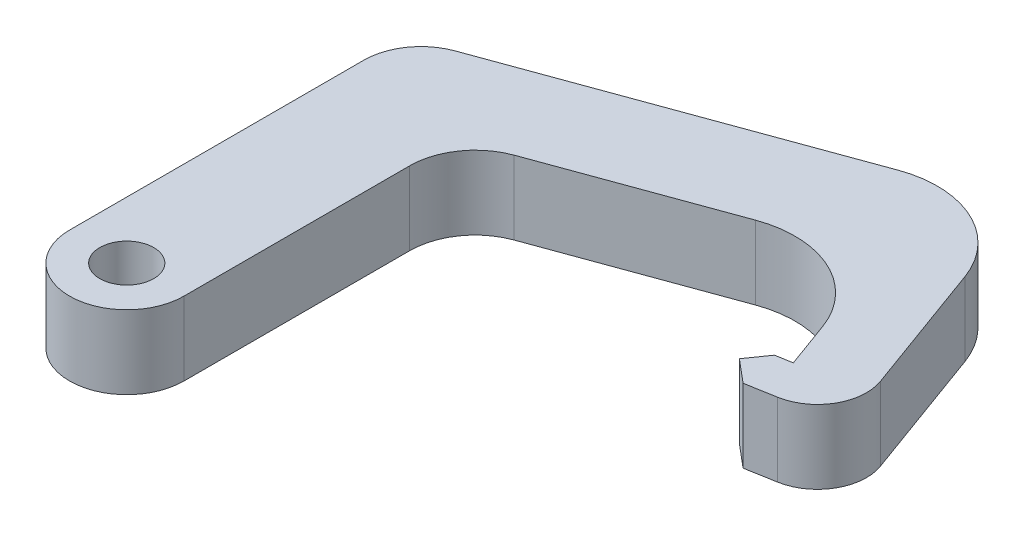
ISO-10303-21;
HEADER;
FILE_DESCRIPTION(('STEP AP214'),'2;1');
FILE_NAME('part.step','',(''),(''),'','','');
FILE_SCHEMA(('AUTOMOTIVE_DESIGN { 1 0 10303 214 1 1 1 1 }'));
ENDSEC;
DATA;
#1=APPLICATION_CONTEXT('core data for automotive mechanical design processes');
#2=APPLICATION_PROTOCOL_DEFINITION('international standard','automotive_design',2000,#1);
#3=PRODUCT_CONTEXT('',#1,'mechanical');
#4=PRODUCT('Part','Part','',(#3));
#5=PRODUCT_RELATED_PRODUCT_CATEGORY('part','',(#4));
#6=PRODUCT_DEFINITION_FORMATION('','',#4);
#7=PRODUCT_DEFINITION_CONTEXT('part definition',#1,'design');
#8=PRODUCT_DEFINITION('design','',#6,#7);
#9=PRODUCT_DEFINITION_SHAPE('','',#8);
#10=(LENGTH_UNIT() NAMED_UNIT(*) SI_UNIT(.MILLI.,.METRE.));
#11=(NAMED_UNIT(*) PLANE_ANGLE_UNIT() SI_UNIT($,.RADIAN.));
#12=(NAMED_UNIT(*) SI_UNIT($,.STERADIAN.) SOLID_ANGLE_UNIT());
#13=UNCERTAINTY_MEASURE_WITH_UNIT(LENGTH_MEASURE(1.E-05),#10,'distance_accuracy_value','');
#14=(GEOMETRIC_REPRESENTATION_CONTEXT(3) GLOBAL_UNCERTAINTY_ASSIGNED_CONTEXT((#13)) GLOBAL_UNIT_ASSIGNED_CONTEXT((#10,
#11,#12)) REPRESENTATION_CONTEXT('',''));
#15=CARTESIAN_POINT('',(0.,0.,0.));
#16=DIRECTION('',(0.,0.,1.));
#17=DIRECTION('',(1.,0.,0.));
#18=AXIS2_PLACEMENT_3D('',#15,#16,#17);
#19=CARTESIAN_POINT('',(3.5,4.5,0.));
#20=DIRECTION('',(-1.,0.,0.));
#21=DIRECTION('',(0.,0.,1.));
#22=AXIS2_PLACEMENT_3D('',#19,#20,#21);
#23=PLANE('',#22);
#24=DIRECTION('',(0.,0.,-1.));
#25=VECTOR('',#24,1.);
#26=CARTESIAN_POINT('',(3.5,0.,0.));
#27=LINE('',#26,#25);
#28=CARTESIAN_POINT('',(3.5,0.,0.));
#29=VERTEX_POINT('',#28);
#30=CARTESIAN_POINT('',(3.5,0.,-13.8126212359031));
#31=VERTEX_POINT('',#30);
#32=EDGE_CURVE('E204',#29,#31,#27,.T.);
#33=ORIENTED_EDGE('',*,*,#32,.T.);
#34=DIRECTION('',(0.,-1.,0.));
#35=VECTOR('',#34,1.);
#36=CARTESIAN_POINT('',(3.5,4.5,-13.8126212359031));
#37=LINE('',#36,#35);
#38=CARTESIAN_POINT('',(3.5,4.5,-13.8126212359031));
#39=VERTEX_POINT('',#38);
#40=EDGE_CURVE('E243',#31,#39,#37,.F.);
#41=ORIENTED_EDGE('',*,*,#40,.T.);
#42=DIRECTION('',(0.,0.,-1.));
#43=VECTOR('',#42,1.);
#44=CARTESIAN_POINT('',(3.5,4.5,0.));
#45=LINE('',#44,#43);
#46=CARTESIAN_POINT('',(3.5,4.5,0.));
#47=VERTEX_POINT('',#46);
#48=EDGE_CURVE('E339',#47,#39,#45,.T.);
#49=ORIENTED_EDGE('',*,*,#48,.F.);
#50=DIRECTION('',(0.,-1.,0.));
#51=VECTOR('',#50,1.);
#52=CARTESIAN_POINT('',(3.5,4.5,0.));
#53=LINE('',#52,#51);
#54=EDGE_CURVE('E200',#47,#29,#53,.T.);
#55=ORIENTED_EDGE('',*,*,#54,.T.);
#56=EDGE_LOOP('',(#33,#41,#49,#55));
#57=FACE_BOUND('',#56,.T.);
#58=ADVANCED_FACE('F44',(#57),#23,.F.);
#59=CARTESIAN_POINT('',(-4.93003812886465,4.5,-13.5451684361061));
#60=DIRECTION('',(0.342020143325666,0.,0.939692620785909));
#61=DIRECTION('',(0.93969262078591,0.,-0.342020143325666));
#62=AXIS2_PLACEMENT_3D('',#59,#60,#61);
#63=PLANE('',#62);
#64=DIRECTION('',(-0.939692620785909,0.,0.342020143325666));
#65=VECTOR('',#64,1.);
#66=CARTESIAN_POINT('',(-4.93003812886465,0.,-13.5451684361061));
#67=LINE('',#66,#65);
#68=CARTESIAN_POINT('',(16.959118700357,0.,-21.5121699751274));
#69=VERTEX_POINT('',#68);
#70=CARTESIAN_POINT('',(6.13191942669734,0.,-17.5713917190467));
#71=VERTEX_POINT('',#70);
#72=EDGE_CURVE('E207',#69,#71,#67,.T.);
#73=ORIENTED_EDGE('',*,*,#72,.F.);
#74=DIRECTION('',(0.,-1.,0.));
#75=VECTOR('',#74,1.);
#76=CARTESIAN_POINT('',(16.959118700357,4.5,-21.5121699751274));
#77=LINE('',#76,#75);
#78=CARTESIAN_POINT('',(16.959118700357,4.5,-21.5121699751274));
#79=VERTEX_POINT('',#78);
#80=EDGE_CURVE('E261',#69,#79,#77,.F.);
#81=ORIENTED_EDGE('',*,*,#80,.T.);
#82=DIRECTION('',(-0.939692620785909,0.,0.342020143325666));
#83=VECTOR('',#82,1.);
#84=CARTESIAN_POINT('',(-4.93003812886465,4.5,-13.5451684361061));
#85=LINE('',#84,#83);
#86=CARTESIAN_POINT('',(6.13191942669734,4.5,-17.5713917190467));
#87=VERTEX_POINT('',#86);
#88=EDGE_CURVE('E168',#79,#87,#85,.T.);
#89=ORIENTED_EDGE('',*,*,#88,.T.);
#90=DIRECTION('',(0.,-1.,0.));
#91=VECTOR('',#90,1.);
#92=CARTESIAN_POINT('',(6.13191942669734,4.5,-17.5713917190467));
#93=LINE('',#92,#91);
#94=EDGE_CURVE('E175',#87,#71,#93,.T.);
#95=ORIENTED_EDGE('',*,*,#94,.T.);
#96=EDGE_LOOP('',(#73,#81,#89,#95));
#97=FACE_BOUND('',#96,.T.);
#98=ADVANCED_FACE('F300',(#97),#63,.T.);
#99=CARTESIAN_POINT('',(27.5273125539371,4.5,-10.0191223989754));
#100=DIRECTION('',(0.939692620785909,0.,-0.342020143325666));
#101=DIRECTION('',(-0.342020143325666,0.,-0.939692620785909));
#102=AXIS2_PLACEMENT_3D('',#99,#100,#101);
#103=PLANE('',#102);
#104=DIRECTION('',(0.342020143325666,0.,0.939692620785909));
#105=VECTOR('',#104,1.);
#106=CARTESIAN_POINT('',(27.5273125539371,4.5,-10.0191223989754));
#107=LINE('',#106,#105);
#108=CARTESIAN_POINT('',(24.6493952850264,4.5,-17.926135110366));
#109=VERTEX_POINT('',#108);
#110=CARTESIAN_POINT('',(25.6754557150034,4.5,-15.1070572480082));
#111=VERTEX_POINT('',#110);
#112=EDGE_CURVE('E157',#109,#111,#107,.T.);
#113=ORIENTED_EDGE('',*,*,#112,.F.);
#114=DIRECTION('',(0.,-1.,0.));
#115=VECTOR('',#114,1.);
#116=CARTESIAN_POINT('',(24.6493952850264,4.5,-17.926135110366));
#117=LINE('',#116,#115);
#118=CARTESIAN_POINT('',(24.6493952850264,0.,-17.926135110366));
#119=VERTEX_POINT('',#118);
#120=EDGE_CURVE('E259',#109,#119,#117,.T.);
#121=ORIENTED_EDGE('',*,*,#120,.T.);
#122=DIRECTION('',(0.342020143325666,0.,0.939692620785909));
#123=VECTOR('',#122,1.);
#124=CARTESIAN_POINT('',(27.5273125539371,0.,-10.0191223989754));
#125=LINE('',#124,#123);
#126=CARTESIAN_POINT('',(25.6754557150034,0.,-15.1070572480082));
#127=VERTEX_POINT('',#126);
#128=EDGE_CURVE('E174',#119,#127,#125,.T.);
#129=ORIENTED_EDGE('',*,*,#128,.T.);
#130=DIRECTION('',(0.,-1.,0.));
#131=VECTOR('',#130,1.);
#132=CARTESIAN_POINT('',(25.6754557150034,4.5,-15.1070572480082));
#133=LINE('',#132,#131);
#134=EDGE_CURVE('E171',#111,#127,#133,.T.);
#135=ORIENTED_EDGE('',*,*,#134,.F.);
#136=EDGE_LOOP('',(#113,#121,#129,#135));
#137=FACE_BOUND('',#136,.T.);
#138=ADVANCED_FACE('F172',(#137),#103,.F.);
#139=CARTESIAN_POINT('',(-1.80924922044675,4.5,-10.2607622110774));
#140=DIRECTION('',(0.173648177666927,0.,0.984807753012209));
#141=DIRECTION('',(0.984807753012209,0.,-0.173648177666927));
#142=AXIS2_PLACEMENT_3D('',#139,#140,#141);
#143=PLANE('',#142);
#144=DIRECTION('',(-0.984807753012209,0.,0.173648177666927));
#145=VECTOR('',#144,1.);
#146=CARTESIAN_POINT('',(-1.80924922044675,0.,-10.2607622110774));
#147=LINE('',#146,#145);
#148=CARTESIAN_POINT('',(24.6906479619912,0.,-14.9334090703413));
#149=VERTEX_POINT('',#148);
#150=EDGE_CURVE('E210',#127,#149,#147,.T.);
#151=ORIENTED_EDGE('',*,*,#150,.T.);
#152=DIRECTION('',(0.,1.,0.));
#153=VECTOR('',#152,1.);
#154=CARTESIAN_POINT('',(24.6906479619912,4.5,-14.9334090703413));
#155=LINE('',#154,#153);
#156=CARTESIAN_POINT('',(24.6906479619912,4.5,-14.9334090703413));
#157=VERTEX_POINT('',#156);
#158=EDGE_CURVE('E53',#149,#157,#155,.T.);
#159=ORIENTED_EDGE('',*,*,#158,.T.);
#160=DIRECTION('',(-0.984807753012209,0.,0.173648177666927));
#161=VECTOR('',#160,1.);
#162=CARTESIAN_POINT('',(-1.80924922044675,4.5,-10.2607622110774));
#163=LINE('',#162,#161);
#164=EDGE_CURVE('E160',#111,#157,#163,.T.);
#165=ORIENTED_EDGE('',*,*,#164,.F.);
#166=ORIENTED_EDGE('',*,*,#134,.T.);
#167=EDGE_LOOP('',(#151,#159,#165,#166));
#168=FACE_BOUND('',#167,.T.);
#169=ADVANCED_FACE('F178',(#168),#143,.F.);
#170=CARTESIAN_POINT('',(16.5700417316632,4.5,-19.7474067631455));
#171=DIRECTION('',(-0.64278760968654,0.,0.766044443118978));
#172=DIRECTION('',(0.766044443118978,0.,0.64278760968654));
#173=AXIS2_PLACEMENT_3D('',#170,#171,#172);
#174=PLANE('',#173);
#175=DIRECTION('',(-0.766044443118978,0.,-0.64278760968654));
#176=VECTOR('',#175,1.);
#177=CARTESIAN_POINT('',(16.5700417316632,4.5,-19.7474067631455));
#178=LINE('',#177,#176);
#179=CARTESIAN_POINT('',(25.2210324559668,4.5,-12.4883636370643));
#180=VERTEX_POINT('',#179);
#181=CARTESIAN_POINT('',(23.8085211194927,4.5,-13.6736013785334));
#182=VERTEX_POINT('',#181);
#183=EDGE_CURVE('E179',#180,#182,#178,.T.);
#184=ORIENTED_EDGE('',*,*,#183,.T.);
#185=DIRECTION('',(0.,-1.,0.));
#186=VECTOR('',#185,1.);
#187=CARTESIAN_POINT('',(23.8085211194927,0.,-13.6736013785334));
#188=LINE('',#187,#186);
#189=CARTESIAN_POINT('',(23.8085211194927,0.,-13.6736013785334));
#190=VERTEX_POINT('',#189);
#191=EDGE_CURVE('E275',#182,#190,#188,.T.);
#192=ORIENTED_EDGE('',*,*,#191,.T.);
#193=DIRECTION('',(-0.766044443118978,0.,-0.64278760968654));
#194=VECTOR('',#193,1.);
#195=CARTESIAN_POINT('',(16.5700417316632,0.,-19.7474067631455));
#196=LINE('',#195,#194);
#197=CARTESIAN_POINT('',(25.2210324559668,0.,-12.4883636370643));
#198=VERTEX_POINT('',#197);
#199=EDGE_CURVE('E212',#198,#190,#196,.T.);
#200=ORIENTED_EDGE('',*,*,#199,.F.);
#201=DIRECTION('',(0.,-1.,0.));
#202=VECTOR('',#201,1.);
#203=CARTESIAN_POINT('',(25.2210324559668,4.5,-12.4883636370643));
#204=LINE('',#203,#202);
#205=EDGE_CURVE('E176',#180,#198,#204,.T.);
#206=ORIENTED_EDGE('',*,*,#205,.F.);
#207=EDGE_LOOP('',(#184,#192,#200,#206));
#208=FACE_BOUND('',#207,.T.);
#209=ADVANCED_FACE('F281',(#208),#174,.T.);
#210=CARTESIAN_POINT('',(-1.37512877627942,4.5,-7.79874282854692));
#211=DIRECTION('',(0.173648177666924,0.,0.984807753012209));
#212=DIRECTION('',(0.984807753012209,0.,-0.173648177666924));
#213=AXIS2_PLACEMENT_3D('',#210,#211,#212);
#214=PLANE('',#213);
#215=DIRECTION('',(-0.984807753012209,0.,0.173648177666924));
#216=VECTOR('',#215,1.);
#217=CARTESIAN_POINT('',(-1.37512877627942,0.,-7.79874282854692));
#218=LINE('',#217,#216);
#219=CARTESIAN_POINT('',(27.0227520703373,0.,-12.8060554167494));
#220=VERTEX_POINT('',#219);
#221=EDGE_CURVE('E214',#220,#198,#218,.T.);
#222=ORIENTED_EDGE('',*,*,#221,.F.);
#223=DIRECTION('',(0.,-1.,0.));
#224=VECTOR('',#223,1.);
#225=CARTESIAN_POINT('',(27.0227520703373,4.5,-12.8060554167494));
#226=LINE('',#225,#224);
#227=CARTESIAN_POINT('',(27.0227520703373,4.5,-12.8060554167494));
#228=VERTEX_POINT('',#227);
#229=EDGE_CURVE('E271',#220,#228,#226,.F.);
#230=ORIENTED_EDGE('',*,*,#229,.T.);
#231=DIRECTION('',(-0.984807753012209,0.,0.173648177666924));
#232=VECTOR('',#231,1.);
#233=CARTESIAN_POINT('',(-1.37512877627942,4.5,-7.79874282854692));
#234=LINE('',#233,#232);
#235=EDGE_CURVE('E182',#228,#180,#234,.T.);
#236=ORIENTED_EDGE('',*,*,#235,.T.);
#237=ORIENTED_EDGE('',*,*,#205,.T.);
#238=EDGE_LOOP('',(#222,#230,#236,#237));
#239=FACE_BOUND('',#238,.T.);
#240=ADVANCED_FACE('F289',(#239),#214,.T.);
#241=CARTESIAN_POINT('',(31.2860830370807,4.5,-11.387202972278));
#242=DIRECTION('',(0.939692620785909,0.,-0.342020143325666));
#243=DIRECTION('',(-0.342020143325666,0.,-0.93969262078591));
#244=AXIS2_PLACEMENT_3D('',#241,#242,#243);
#245=PLANE('',#244);
#246=DIRECTION('',(0.342020143325666,0.,0.939692620785909));
#247=VECTOR('',#246,1.);
#248=CARTESIAN_POINT('',(31.2860830370807,4.5,-11.387202972278));
#249=LINE('',#248,#247);
#250=CARTESIAN_POINT('',(26.3560449082161,4.5,-24.9323714083841));
#251=VERTEX_POINT('',#250);
#252=CARTESIAN_POINT('',(29.3208853996942,4.5,-16.786539105763));
#253=VERTEX_POINT('',#252);
#254=EDGE_CURVE('E187',#251,#253,#249,.T.);
#255=ORIENTED_EDGE('',*,*,#254,.T.);
#256=DIRECTION('',(0.,-1.,0.));
#257=VECTOR('',#256,1.);
#258=CARTESIAN_POINT('',(29.3208853996942,4.5,-16.786539105763));
#259=LINE('',#258,#257);
#260=CARTESIAN_POINT('',(29.3208853996942,0.,-16.786539105763));
#261=VERTEX_POINT('',#260);
#262=EDGE_CURVE('E266',#253,#261,#259,.T.);
#263=ORIENTED_EDGE('',*,*,#262,.T.);
#264=DIRECTION('',(0.342020143325666,0.,0.939692620785909));
#265=VECTOR('',#264,1.);
#266=CARTESIAN_POINT('',(31.2860830370807,0.,-11.387202972278));
#267=LINE('',#266,#265);
#268=CARTESIAN_POINT('',(26.3560449082161,0.,-24.9323714083841));
#269=VERTEX_POINT('',#268);
#270=EDGE_CURVE('E216',#269,#261,#267,.T.);
#271=ORIENTED_EDGE('',*,*,#270,.F.);
#272=DIRECTION('',(0.,-1.,0.));
#273=VECTOR('',#272,1.);
#274=CARTESIAN_POINT('',(26.3560449082161,4.5,-24.9323714083841));
#275=LINE('',#274,#273);
#276=EDGE_CURVE('E255',#269,#251,#275,.F.);
#277=ORIENTED_EDGE('',*,*,#276,.T.);
#278=EDGE_LOOP('',(#255,#263,#271,#277));
#279=FACE_BOUND('',#278,.T.);
#280=ADVANCED_FACE('F359',(#279),#245,.T.);
#281=CARTESIAN_POINT('',(-6.98215898881865,4.5,-19.1833241608215));
#282=DIRECTION('',(-0.342020143325666,0.,-0.939692620785909));
#283=DIRECTION('',(-0.93969262078591,0.,0.342020143325666));
#284=AXIS2_PLACEMENT_3D('',#281,#282,#283);
#285=PLANE('',#284);
#286=DIRECTION('',(0.939692620785909,0.,-0.342020143325666));
#287=VECTOR('',#286,1.);
#288=CARTESIAN_POINT('',(-6.98215898881865,4.5,-19.1833241608215));
#289=LINE('',#288,#287);
#290=CARTESIAN_POINT('',(-1.19707050163983,4.5,-21.2889241727507));
#291=VERTEX_POINT('',#290);
#292=CARTESIAN_POINT('',(18.6657683235466,4.5,-28.5184062731456));
#293=VERTEX_POINT('',#292);
#294=EDGE_CURVE('E190',#291,#293,#289,.T.);
#295=ORIENTED_EDGE('',*,*,#294,.T.);
#296=DIRECTION('',(0.,-1.,0.));
#297=VECTOR('',#296,1.);
#298=CARTESIAN_POINT('',(18.6657683235466,4.5,-28.5184062731456));
#299=LINE('',#298,#297);
#300=CARTESIAN_POINT('',(18.6657683235466,0.,-28.5184062731456));
#301=VERTEX_POINT('',#300);
#302=EDGE_CURVE('E250',#293,#301,#299,.T.);
#303=ORIENTED_EDGE('',*,*,#302,.T.);
#304=DIRECTION('',(0.939692620785909,0.,-0.342020143325666));
#305=VECTOR('',#304,1.);
#306=CARTESIAN_POINT('',(-6.98215898881865,0.,-19.1833241608215));
#307=LINE('',#306,#305);
#308=CARTESIAN_POINT('',(-1.19707050163983,0.,-21.2889241727507));
#309=VERTEX_POINT('',#308);
#310=EDGE_CURVE('E219',#309,#301,#307,.T.);
#311=ORIENTED_EDGE('',*,*,#310,.F.);
#312=DIRECTION('',(0.,-1.,0.));
#313=VECTOR('',#312,1.);
#314=CARTESIAN_POINT('',(-1.19707050163983,4.5,-21.2889241727507));
#315=LINE('',#314,#313);
#316=EDGE_CURVE('E237',#291,#309,#315,.T.);
#317=ORIENTED_EDGE('',*,*,#316,.F.);
#318=EDGE_LOOP('',(#295,#303,#311,#317));
#319=FACE_BOUND('',#318,.T.);
#320=ADVANCED_FACE('F352',(#319),#285,.T.);
#321=CARTESIAN_POINT('',(0.,4.5,-18.));
#322=DIRECTION('',(0.,-1.,0.));
#323=DIRECTION('',(0.,0.,-1.));
#324=AXIS2_PLACEMENT_3D('',#321,#322,#323);
#325=CYLINDRICAL_SURFACE('',#324,3.5);
#326=CARTESIAN_POINT('',(0.,0.,-18.));
#327=DIRECTION('',(0.,1.,0.));
#328=DIRECTION('',(0.,0.,1.));
#329=AXIS2_PLACEMENT_3D('',#326,#327,#328);
#330=CIRCLE('',#329,3.5);
#331=CARTESIAN_POINT('',(-3.5,0.,-18.));
#332=VERTEX_POINT('',#331);
#333=EDGE_CURVE('E222',#309,#332,#330,.T.);
#334=ORIENTED_EDGE('',*,*,#333,.T.);
#335=DIRECTION('',(0.,-1.,0.));
#336=VECTOR('',#335,1.);
#337=CARTESIAN_POINT('',(-3.5,4.5,-18.));
#338=LINE('',#337,#336);
#339=CARTESIAN_POINT('',(-3.5,4.5,-18.));
#340=VERTEX_POINT('',#339);
#341=EDGE_CURVE('E235',#340,#332,#338,.T.);
#342=ORIENTED_EDGE('',*,*,#341,.F.);
#343=CARTESIAN_POINT('',(0.,4.5,-18.));
#344=DIRECTION('',(0.,1.,0.));
#345=DIRECTION('',(0.,0.,1.));
#346=AXIS2_PLACEMENT_3D('',#343,#344,#345);
#347=CIRCLE('',#346,3.5);
#348=EDGE_CURVE('E193',#291,#340,#347,.T.);
#349=ORIENTED_EDGE('',*,*,#348,.F.);
#350=ORIENTED_EDGE('',*,*,#316,.T.);
#351=EDGE_LOOP('',(#334,#342,#349,#350));
#352=FACE_BOUND('',#351,.T.);
#353=ADVANCED_FACE('F349',(#352),#325,.T.);
#354=CARTESIAN_POINT('',(-3.5,4.5,0.));
#355=DIRECTION('',(-1.,0.,0.));
#356=DIRECTION('',(0.,0.,1.));
#357=AXIS2_PLACEMENT_3D('',#354,#355,#356);
#358=PLANE('',#357);
#359=DIRECTION('',(0.,0.,-1.));
#360=VECTOR('',#359,1.);
#361=CARTESIAN_POINT('',(-3.5,0.,0.));
#362=LINE('',#361,#360);
#363=CARTESIAN_POINT('',(-3.5,0.,0.));
#364=VERTEX_POINT('',#363);
#365=EDGE_CURVE('E225',#364,#332,#362,.T.);
#366=ORIENTED_EDGE('',*,*,#365,.F.);
#367=DIRECTION('',(0.,-1.,0.));
#368=VECTOR('',#367,1.);
#369=CARTESIAN_POINT('',(-3.5,4.5,0.));
#370=LINE('',#369,#368);
#371=CARTESIAN_POINT('',(-3.5,4.5,0.));
#372=VERTEX_POINT('',#371);
#373=EDGE_CURVE('E233',#372,#364,#370,.T.);
#374=ORIENTED_EDGE('',*,*,#373,.F.);
#375=DIRECTION('',(0.,0.,-1.));
#376=VECTOR('',#375,1.);
#377=CARTESIAN_POINT('',(-3.5,4.5,0.));
#378=LINE('',#377,#376);
#379=EDGE_CURVE('E195',#372,#340,#378,.T.);
#380=ORIENTED_EDGE('',*,*,#379,.T.);
#381=ORIENTED_EDGE('',*,*,#341,.T.);
#382=EDGE_LOOP('',(#366,#374,#380,#381));
#383=FACE_BOUND('',#382,.T.);
#384=ADVANCED_FACE('F314',(#383),#358,.T.);
#385=CARTESIAN_POINT('',(0.,4.5,0.));
#386=DIRECTION('',(0.,-1.,0.));
#387=DIRECTION('',(0.,0.,-1.));
#388=AXIS2_PLACEMENT_3D('',#385,#386,#387);
#389=CYLINDRICAL_SURFACE('',#388,1.65);
#390=CARTESIAN_POINT('',(0.,4.5,0.));
#391=DIRECTION('',(0.,1.,0.));
#392=DIRECTION('',(0.,0.,1.));
#393=AXIS2_PLACEMENT_3D('',#390,#391,#392);
#394=CIRCLE('',#393,1.65);
#395=CARTESIAN_POINT('',(0.,4.5,1.65));
#396=VERTEX_POINT('',#395);
#397=EDGE_CURVE('E230',#396,#396,#394,.T.);
#398=ORIENTED_EDGE('',*,*,#397,.T.);
#399=EDGE_LOOP('',(#398));
#400=FACE_BOUND('',#399,.T.);
#401=CARTESIAN_POINT('',(0.,0.,0.));
#402=DIRECTION('',(0.,1.,0.));
#403=DIRECTION('',(0.,0.,1.));
#404=AXIS2_PLACEMENT_3D('',#401,#402,#403);
#405=CIRCLE('',#404,1.65);
#406=CARTESIAN_POINT('',(0.,0.,1.65));
#407=VERTEX_POINT('',#406);
#408=EDGE_CURVE('E201',#407,#407,#405,.T.);
#409=ORIENTED_EDGE('',*,*,#408,.F.);
#410=EDGE_LOOP('',(#409));
#411=FACE_BOUND('',#410,.T.);
#412=ADVANCED_FACE('F310',(#400,#411),#389,.F.);
#413=CARTESIAN_POINT('',(0.,4.5,0.));
#414=DIRECTION('',(0.,-1.,0.));
#415=DIRECTION('',(0.,0.,-1.));
#416=AXIS2_PLACEMENT_3D('',#413,#414,#415);
#417=CYLINDRICAL_SURFACE('',#416,3.5);
#418=CARTESIAN_POINT('',(0.,0.,0.));
#419=DIRECTION('',(0.,1.,0.));
#420=DIRECTION('',(0.,0.,1.));
#421=AXIS2_PLACEMENT_3D('',#418,#419,#420);
#422=CIRCLE('',#421,3.5);
#423=EDGE_CURVE('E228',#364,#29,#422,.T.);
#424=ORIENTED_EDGE('',*,*,#423,.T.);
#425=ORIENTED_EDGE('',*,*,#54,.F.);
#426=CARTESIAN_POINT('',(0.,4.5,0.));
#427=DIRECTION('',(0.,1.,0.));
#428=DIRECTION('',(0.,0.,1.));
#429=AXIS2_PLACEMENT_3D('',#426,#427,#428);
#430=CIRCLE('',#429,3.5);
#431=EDGE_CURVE('E198',#372,#47,#430,.T.);
#432=ORIENTED_EDGE('',*,*,#431,.F.);
#433=ORIENTED_EDGE('',*,*,#373,.T.);
#434=EDGE_LOOP('',(#424,#425,#432,#433));
#435=FACE_BOUND('',#434,.T.);
#436=ADVANCED_FACE('F313',(#435),#417,.T.);
#437=CARTESIAN_POINT('',(0.,4.5,0.));
#438=DIRECTION('',(0.,1.,0.));
#439=DIRECTION('',(0.,0.,1.));
#440=AXIS2_PLACEMENT_3D('',#437,#438,#439);
#441=PLANE('',#440);
#442=ORIENTED_EDGE('',*,*,#397,.F.);
#443=EDGE_LOOP('',(#442));
#444=FACE_BOUND('',#443,.T.);
#445=ORIENTED_EDGE('',*,*,#164,.T.);
#446=DIRECTION('',(-0.573576436351052,0.,0.819152044288988));
#447=VECTOR('',#446,1.);
#448=CARTESIAN_POINT('',(9.55126630508881,4.5,6.68786866627168));
#449=LINE('',#448,#447);
#450=EDGE_CURVE('E11',#157,#182,#449,.T.);
#451=ORIENTED_EDGE('',*,*,#450,.T.);
#452=ORIENTED_EDGE('',*,*,#183,.F.);
#453=ORIENTED_EDGE('',*,*,#235,.F.);
#454=CARTESIAN_POINT('',(26.5018075373365,4.5,-15.760478675786));
#455=DIRECTION('',(0.,1.,0.));
#456=DIRECTION('',(0.,0.,1.));
#457=AXIS2_PLACEMENT_3D('',#454,#455,#456);
#458=CIRCLE('',#457,3.);
#459=EDGE_CURVE('E273',#228,#253,#458,.T.);
#460=ORIENTED_EDGE('',*,*,#459,.T.);
#461=ORIENTED_EDGE('',*,*,#254,.F.);
#462=CARTESIAN_POINT('',(20.7178891835006,4.5,-22.8802505484301));
#463=DIRECTION('',(0.,1.,0.));
#464=DIRECTION('',(0.,0.,1.));
#465=AXIS2_PLACEMENT_3D('',#462,#463,#464);
#466=CIRCLE('',#465,6.);
#467=EDGE_CURVE('E257',#251,#293,#466,.T.);
#468=ORIENTED_EDGE('',*,*,#467,.T.);
#469=ORIENTED_EDGE('',*,*,#294,.F.);
#470=ORIENTED_EDGE('',*,*,#348,.T.);
#471=ORIENTED_EDGE('',*,*,#379,.F.);
#472=ORIENTED_EDGE('',*,*,#431,.T.);
#473=ORIENTED_EDGE('',*,*,#48,.T.);
#474=CARTESIAN_POINT('',(7.5,4.5,-13.8126212359031));
#475=DIRECTION('',(0.,1.,0.));
#476=DIRECTION('',(0.,0.,1.));
#477=AXIS2_PLACEMENT_3D('',#474,#475,#476);
#478=CIRCLE('',#477,4.);
#479=EDGE_CURVE('E247',#39,#87,#478,.F.);
#480=ORIENTED_EDGE('',*,*,#479,.T.);
#481=ORIENTED_EDGE('',*,*,#88,.F.);
#482=CARTESIAN_POINT('',(19.011239560311,4.5,-15.874014250412));
#483=DIRECTION('',(0.,1.,0.));
#484=DIRECTION('',(0.,0.,1.));
#485=AXIS2_PLACEMENT_3D('',#482,#483,#484);
#486=CIRCLE('',#485,6.);
#487=EDGE_CURVE('E164',#79,#109,#486,.F.);
#488=ORIENTED_EDGE('',*,*,#487,.T.);
#489=ORIENTED_EDGE('',*,*,#112,.T.);
#490=EDGE_LOOP('',(#445,#451,#452,#453,#460,#461,#468,#469,#470,#471,#472,#473,#480,#481,#488,#489));
#491=FACE_BOUND('',#490,.T.);
#492=ADVANCED_FACE('F159',(#444,#491),#441,.T.);
#493=CARTESIAN_POINT('',(0.,0.,0.));
#494=DIRECTION('',(0.,1.,0.));
#495=DIRECTION('',(0.,0.,1.));
#496=AXIS2_PLACEMENT_3D('',#493,#494,#495);
#497=PLANE('',#496);
#498=ORIENTED_EDGE('',*,*,#408,.T.);
#499=EDGE_LOOP('',(#498));
#500=FACE_BOUND('',#499,.T.);
#501=ORIENTED_EDGE('',*,*,#199,.T.);
#502=DIRECTION('',(0.573576436351052,0.,-0.819152044288988));
#503=VECTOR('',#502,1.);
#504=CARTESIAN_POINT('',(23.8085211194927,0.,-13.6736013785334));
#505=LINE('',#504,#503);
#506=EDGE_CURVE('E67',#190,#149,#505,.T.);
#507=ORIENTED_EDGE('',*,*,#506,.T.);
#508=ORIENTED_EDGE('',*,*,#150,.F.);
#509=ORIENTED_EDGE('',*,*,#128,.F.);
#510=CARTESIAN_POINT('',(19.011239560311,0.,-15.874014250412));
#511=DIRECTION('',(0.,1.,0.));
#512=DIRECTION('',(0.,0.,1.));
#513=AXIS2_PLACEMENT_3D('',#510,#511,#512);
#514=CIRCLE('',#513,6.);
#515=EDGE_CURVE('E263',#119,#69,#514,.T.);
#516=ORIENTED_EDGE('',*,*,#515,.T.);
#517=ORIENTED_EDGE('',*,*,#72,.T.);
#518=CARTESIAN_POINT('',(7.5,0.,-13.8126212359031));
#519=DIRECTION('',(0.,1.,0.));
#520=DIRECTION('',(0.,0.,1.));
#521=AXIS2_PLACEMENT_3D('',#518,#519,#520);
#522=CIRCLE('',#521,4.);
#523=EDGE_CURVE('E245',#71,#31,#522,.T.);
#524=ORIENTED_EDGE('',*,*,#523,.T.);
#525=ORIENTED_EDGE('',*,*,#32,.F.);
#526=ORIENTED_EDGE('',*,*,#423,.F.);
#527=ORIENTED_EDGE('',*,*,#365,.T.);
#528=ORIENTED_EDGE('',*,*,#333,.F.);
#529=ORIENTED_EDGE('',*,*,#310,.T.);
#530=CARTESIAN_POINT('',(20.7178891835006,0.,-22.8802505484301));
#531=DIRECTION('',(0.,1.,0.));
#532=DIRECTION('',(0.,0.,1.));
#533=AXIS2_PLACEMENT_3D('',#530,#531,#532);
#534=CIRCLE('',#533,6.);
#535=EDGE_CURVE('E253',#301,#269,#534,.F.);
#536=ORIENTED_EDGE('',*,*,#535,.T.);
#537=ORIENTED_EDGE('',*,*,#270,.T.);
#538=CARTESIAN_POINT('',(26.5018075373365,0.,-15.760478675786));
#539=DIRECTION('',(0.,1.,0.));
#540=DIRECTION('',(0.,0.,1.));
#541=AXIS2_PLACEMENT_3D('',#538,#539,#540);
#542=CIRCLE('',#541,3.);
#543=EDGE_CURVE('E269',#261,#220,#542,.F.);
#544=ORIENTED_EDGE('',*,*,#543,.T.);
#545=ORIENTED_EDGE('',*,*,#221,.T.);
#546=EDGE_LOOP('',(#501,#507,#508,#509,#516,#517,#524,#525,#526,#527,#528,#529,#536,#537,#544,#545));
#547=FACE_BOUND('',#546,.T.);
#548=ADVANCED_FACE('F285',(#500,#547),#497,.F.);
#549=CARTESIAN_POINT('',(7.5,4.5,-13.8126212359031));
#550=DIRECTION('',(0.,-1.,0.));
#551=DIRECTION('',(0.,0.,-1.));
#552=AXIS2_PLACEMENT_3D('',#549,#550,#551);
#553=CYLINDRICAL_SURFACE('',#552,4.);
#554=ORIENTED_EDGE('',*,*,#479,.F.);
#555=ORIENTED_EDGE('',*,*,#40,.F.);
#556=ORIENTED_EDGE('',*,*,#523,.F.);
#557=ORIENTED_EDGE('',*,*,#94,.F.);
#558=EDGE_LOOP('',(#554,#555,#556,#557));
#559=FACE_BOUND('',#558,.T.);
#560=ADVANCED_FACE('F316',(#559),#553,.F.);
#561=CARTESIAN_POINT('',(20.7178891835006,4.5,-22.8802505484301));
#562=DIRECTION('',(0.,-1.,0.));
#563=DIRECTION('',(0.,0.,-1.));
#564=AXIS2_PLACEMENT_3D('',#561,#562,#563);
#565=CYLINDRICAL_SURFACE('',#564,6.);
#566=ORIENTED_EDGE('',*,*,#467,.F.);
#567=ORIENTED_EDGE('',*,*,#276,.F.);
#568=ORIENTED_EDGE('',*,*,#535,.F.);
#569=ORIENTED_EDGE('',*,*,#302,.F.);
#570=EDGE_LOOP('',(#566,#567,#568,#569));
#571=FACE_BOUND('',#570,.T.);
#572=ADVANCED_FACE('F319',(#571),#565,.T.);
#573=CARTESIAN_POINT('',(19.011239560311,4.5,-15.874014250412));
#574=DIRECTION('',(0.,-1.,0.));
#575=DIRECTION('',(0.,0.,-1.));
#576=AXIS2_PLACEMENT_3D('',#573,#574,#575);
#577=CYLINDRICAL_SURFACE('',#576,6.);
#578=ORIENTED_EDGE('',*,*,#487,.F.);
#579=ORIENTED_EDGE('',*,*,#80,.F.);
#580=ORIENTED_EDGE('',*,*,#515,.F.);
#581=ORIENTED_EDGE('',*,*,#120,.F.);
#582=EDGE_LOOP('',(#578,#579,#580,#581));
#583=FACE_BOUND('',#582,.T.);
#584=ADVANCED_FACE('F297',(#583),#577,.F.);
#585=CARTESIAN_POINT('',(26.5018075373365,4.5,-15.760478675786));
#586=DIRECTION('',(0.,-1.,0.));
#587=DIRECTION('',(0.,0.,-1.));
#588=AXIS2_PLACEMENT_3D('',#585,#586,#587);
#589=CYLINDRICAL_SURFACE('',#588,3.);
#590=ORIENTED_EDGE('',*,*,#459,.F.);
#591=ORIENTED_EDGE('',*,*,#229,.F.);
#592=ORIENTED_EDGE('',*,*,#543,.F.);
#593=ORIENTED_EDGE('',*,*,#262,.F.);
#594=EDGE_LOOP('',(#590,#591,#592,#593));
#595=FACE_BOUND('',#594,.T.);
#596=ADVANCED_FACE('F293',(#595),#589,.T.);
#597=CARTESIAN_POINT('',(23.8085211194927,4.5,-13.6736013785334));
#598=DIRECTION('',(-0.819152044288988,0.,-0.573576436351052));
#599=DIRECTION('',(0.,1.,0.));
#600=AXIS2_PLACEMENT_3D('',#597,#598,#599);
#601=PLANE('',#600);
#602=ORIENTED_EDGE('',*,*,#450,.F.);
#603=ORIENTED_EDGE('',*,*,#158,.F.);
#604=ORIENTED_EDGE('',*,*,#506,.F.);
#605=ORIENTED_EDGE('',*,*,#191,.F.);
#606=EDGE_LOOP('',(#602,#603,#604,#605));
#607=FACE_BOUND('',#606,.T.);
#608=ADVANCED_FACE('F47',(#607),#601,.T.);
#609=CLOSED_SHELL('',(#58,#98,#138,#169,#209,#240,#280,#320,#353,#384,#412,#436,#492,#548,#560,
#572,#584,#596,#608));
#610=MANIFOLD_SOLID_BREP('B2',#609);
#611=ADVANCED_BREP_SHAPE_REPRESENTATION('',(#18,#610),#14);
#612=SHAPE_DEFINITION_REPRESENTATION(#9,#611);
ENDSEC;
END-ISO-10303-21;
